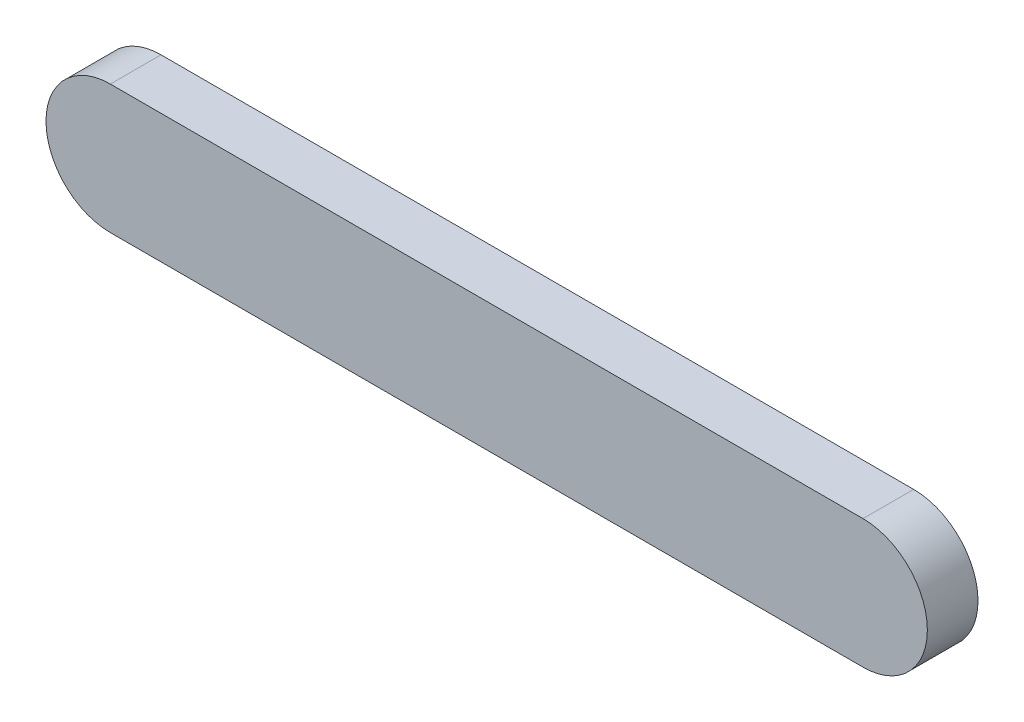
ISO-10303-21;
HEADER;
FILE_DESCRIPTION(('STEP AP214'),'2;1');
FILE_NAME('part.step','',(''),(''),'','','');
FILE_SCHEMA(('AUTOMOTIVE_DESIGN { 1 0 10303 214 1 1 1 1 }'));
ENDSEC;
DATA;
#1=APPLICATION_CONTEXT('core data for automotive mechanical design processes');
#2=APPLICATION_PROTOCOL_DEFINITION('international standard','automotive_design',2000,#1);
#3=PRODUCT_CONTEXT('',#1,'mechanical');
#4=PRODUCT('Part','Part','',(#3));
#5=PRODUCT_RELATED_PRODUCT_CATEGORY('part','',(#4));
#6=PRODUCT_DEFINITION_FORMATION('','',#4);
#7=PRODUCT_DEFINITION_CONTEXT('part definition',#1,'design');
#8=PRODUCT_DEFINITION('design','',#6,#7);
#9=PRODUCT_DEFINITION_SHAPE('','',#8);
#10=(LENGTH_UNIT() NAMED_UNIT(*) SI_UNIT(.MILLI.,.METRE.));
#11=(NAMED_UNIT(*) PLANE_ANGLE_UNIT() SI_UNIT($,.RADIAN.));
#12=(NAMED_UNIT(*) SI_UNIT($,.STERADIAN.) SOLID_ANGLE_UNIT());
#13=UNCERTAINTY_MEASURE_WITH_UNIT(LENGTH_MEASURE(1.E-05),#10,'distance_accuracy_value','');
#14=(GEOMETRIC_REPRESENTATION_CONTEXT(3) GLOBAL_UNCERTAINTY_ASSIGNED_CONTEXT((#13)) GLOBAL_UNIT_ASSIGNED_CONTEXT((#10,
#11,#12)) REPRESENTATION_CONTEXT('',''));
#15=CARTESIAN_POINT('',(0.,0.,0.));
#16=DIRECTION('',(0.,0.,1.));
#17=DIRECTION('',(1.,0.,0.));
#18=AXIS2_PLACEMENT_3D('',#15,#16,#17);
#19=CARTESIAN_POINT('',(129.4892,58.674,0.));
#20=DIRECTION('',(0.,1.,0.));
#21=DIRECTION('',(1.,0.,0.));
#22=AXIS2_PLACEMENT_3D('',#19,#20,#21);
#23=PLANE('',#22);
#24=DIRECTION('',(1.,0.,0.));
#25=VECTOR('',#24,1.);
#26=CARTESIAN_POINT('',(129.4892,58.674,0.1999996));
#27=LINE('',#26,#25);
#28=CARTESIAN_POINT('',(129.4892,58.674,0.1999996));
#29=VERTEX_POINT('',#28);
#30=CARTESIAN_POINT('',(132.461,58.674,0.1999996));
#31=VERTEX_POINT('',#30);
#32=EDGE_CURVE('E11',#29,#31,#27,.T.);
#33=ORIENTED_EDGE('',*,*,#32,.F.);
#34=DIRECTION('',(0.,0.,1.));
#35=VECTOR('',#34,1.);
#36=CARTESIAN_POINT('',(129.4892,58.674,0.));
#37=LINE('',#36,#35);
#38=CARTESIAN_POINT('',(129.4892,58.674,0.));
#39=VERTEX_POINT('',#38);
#40=EDGE_CURVE('E24',#39,#29,#37,.T.);
#41=ORIENTED_EDGE('',*,*,#40,.F.);
#42=DIRECTION('',(1.,0.,0.));
#43=VECTOR('',#42,1.);
#44=CARTESIAN_POINT('',(129.4892,58.674,0.));
#45=LINE('',#44,#43);
#46=CARTESIAN_POINT('',(132.461,58.674,0.));
#47=VERTEX_POINT('',#46);
#48=EDGE_CURVE('E75',#39,#47,#45,.T.);
#49=ORIENTED_EDGE('',*,*,#48,.T.);
#50=DIRECTION('',(0.,0.,1.));
#51=VECTOR('',#50,1.);
#52=CARTESIAN_POINT('',(132.461,58.674,0.));
#53=LINE('',#52,#51);
#54=EDGE_CURVE('E37',#47,#31,#53,.T.);
#55=ORIENTED_EDGE('',*,*,#54,.T.);
#56=EDGE_LOOP('',(#33,#41,#49,#55));
#57=FACE_BOUND('',#56,.T.);
#58=ADVANCED_FACE('F17',(#57),#23,.F.);
#59=CARTESIAN_POINT('',(132.461,58.928,0.));
#60=DIRECTION('',(0.,0.,-1.));
#61=DIRECTION('',(0.,-1.,0.));
#62=AXIS2_PLACEMENT_3D('',#59,#60,#61);
#63=CYLINDRICAL_SURFACE('',#62,0.253999999999998);
#64=CARTESIAN_POINT('',(132.461,58.928,0.1999996));
#65=DIRECTION('',(0.,0.,1.));
#66=DIRECTION('',(0.,-1.,0.));
#67=AXIS2_PLACEMENT_3D('',#64,#65,#66);
#68=CIRCLE('',#67,0.253999999999998);
#69=CARTESIAN_POINT('',(132.461,59.182,0.1999996));
#70=VERTEX_POINT('',#69);
#71=EDGE_CURVE('E83',#31,#70,#68,.T.);
#72=ORIENTED_EDGE('',*,*,#71,.F.);
#73=ORIENTED_EDGE('',*,*,#54,.F.);
#74=CARTESIAN_POINT('',(132.461,58.928,0.));
#75=DIRECTION('',(0.,0.,1.));
#76=DIRECTION('',(0.,-1.,0.));
#77=AXIS2_PLACEMENT_3D('',#74,#75,#76);
#78=CIRCLE('',#77,0.253999999999998);
#79=CARTESIAN_POINT('',(132.461,59.182,0.));
#80=VERTEX_POINT('',#79);
#81=EDGE_CURVE('E81',#47,#80,#78,.T.);
#82=ORIENTED_EDGE('',*,*,#81,.T.);
#83=DIRECTION('',(0.,0.,1.));
#84=VECTOR('',#83,1.);
#85=CARTESIAN_POINT('',(132.461,59.182,0.));
#86=LINE('',#85,#84);
#87=EDGE_CURVE('E67',#80,#70,#86,.T.);
#88=ORIENTED_EDGE('',*,*,#87,.T.);
#89=EDGE_LOOP('',(#72,#73,#82,#88));
#90=FACE_BOUND('',#89,.T.);
#91=ADVANCED_FACE('F89',(#90),#63,.T.);
#92=CARTESIAN_POINT('',(132.461,59.182,0.));
#93=DIRECTION('',(0.,-1.,0.));
#94=DIRECTION('',(-1.,0.,0.));
#95=AXIS2_PLACEMENT_3D('',#92,#93,#94);
#96=PLANE('',#95);
#97=DIRECTION('',(-1.,0.,0.));
#98=VECTOR('',#97,1.);
#99=CARTESIAN_POINT('',(132.461,59.182,0.1999996));
#100=LINE('',#99,#98);
#101=CARTESIAN_POINT('',(129.4892,59.182,0.1999996));
#102=VERTEX_POINT('',#101);
#103=EDGE_CURVE('E71',#70,#102,#100,.T.);
#104=ORIENTED_EDGE('',*,*,#103,.F.);
#105=ORIENTED_EDGE('',*,*,#87,.F.);
#106=DIRECTION('',(-1.,0.,0.));
#107=VECTOR('',#106,1.);
#108=CARTESIAN_POINT('',(132.461,59.182,0.));
#109=LINE('',#108,#107);
#110=CARTESIAN_POINT('',(129.4892,59.182,0.));
#111=VERTEX_POINT('',#110);
#112=EDGE_CURVE('E63',#80,#111,#109,.T.);
#113=ORIENTED_EDGE('',*,*,#112,.T.);
#114=DIRECTION('',(0.,0.,1.));
#115=VECTOR('',#114,1.);
#116=CARTESIAN_POINT('',(129.4892,59.182,0.));
#117=LINE('',#116,#115);
#118=EDGE_CURVE('E53',#111,#102,#117,.T.);
#119=ORIENTED_EDGE('',*,*,#118,.T.);
#120=EDGE_LOOP('',(#104,#105,#113,#119));
#121=FACE_BOUND('',#120,.T.);
#122=ADVANCED_FACE('F66',(#121),#96,.F.);
#123=CARTESIAN_POINT('',(129.4892,58.928,0.));
#124=DIRECTION('',(0.,0.,-1.));
#125=DIRECTION('',(1.11896493820489E-13,1.,0.));
#126=AXIS2_PLACEMENT_3D('',#123,#124,#125);
#127=CYLINDRICAL_SURFACE('',#126,0.253999999999998);
#128=CARTESIAN_POINT('',(129.4892,58.928,0.1999996));
#129=DIRECTION('',(0.,0.,1.));
#130=DIRECTION('',(1.11896493820489E-13,1.,0.));
#131=AXIS2_PLACEMENT_3D('',#128,#129,#130);
#132=CIRCLE('',#131,0.253999999999998);
#133=EDGE_CURVE('E59',#102,#29,#132,.T.);
#134=ORIENTED_EDGE('',*,*,#133,.F.);
#135=ORIENTED_EDGE('',*,*,#118,.F.);
#136=CARTESIAN_POINT('',(129.4892,58.928,0.));
#137=DIRECTION('',(0.,0.,1.));
#138=DIRECTION('',(1.11896493820489E-13,1.,0.));
#139=AXIS2_PLACEMENT_3D('',#136,#137,#138);
#140=CIRCLE('',#139,0.253999999999998);
#141=EDGE_CURVE('E57',#111,#39,#140,.T.);
#142=ORIENTED_EDGE('',*,*,#141,.T.);
#143=ORIENTED_EDGE('',*,*,#40,.T.);
#144=EDGE_LOOP('',(#134,#135,#142,#143));
#145=FACE_BOUND('',#144,.T.);
#146=ADVANCED_FACE('F55',(#145),#127,.T.);
#147=CARTESIAN_POINT('',(129.4892,58.674,0.));
#148=DIRECTION('',(0.,0.,-1.));
#149=DIRECTION('',(-1.,0.,0.));
#150=AXIS2_PLACEMENT_3D('',#147,#148,#149);
#151=PLANE('',#150);
#152=ORIENTED_EDGE('',*,*,#141,.F.);
#153=ORIENTED_EDGE('',*,*,#112,.F.);
#154=ORIENTED_EDGE('',*,*,#81,.F.);
#155=ORIENTED_EDGE('',*,*,#48,.F.);
#156=EDGE_LOOP('',(#152,#153,#154,#155));
#157=FACE_BOUND('',#156,.T.);
#158=ADVANCED_FACE('F74',(#157),#151,.T.);
#159=CARTESIAN_POINT('',(129.4892,58.674,0.1999996));
#160=DIRECTION('',(0.,0.,-1.));
#161=DIRECTION('',(-1.,0.,0.));
#162=AXIS2_PLACEMENT_3D('',#159,#160,#161);
#163=PLANE('',#162);
#164=ORIENTED_EDGE('',*,*,#32,.T.);
#165=ORIENTED_EDGE('',*,*,#71,.T.);
#166=ORIENTED_EDGE('',*,*,#103,.T.);
#167=ORIENTED_EDGE('',*,*,#133,.T.);
#168=EDGE_LOOP('',(#164,#165,#166,#167));
#169=FACE_BOUND('',#168,.T.);
#170=ADVANCED_FACE('F91',(#169),#163,.F.);
#171=CLOSED_SHELL('',(#58,#91,#122,#146,#158,#170));
#172=MANIFOLD_SOLID_BREP('B1',#171);
#173=ADVANCED_BREP_SHAPE_REPRESENTATION('',(#18,#172),#14);
#174=SHAPE_DEFINITION_REPRESENTATION(#9,#173);
ENDSEC;
END-ISO-10303-21;
